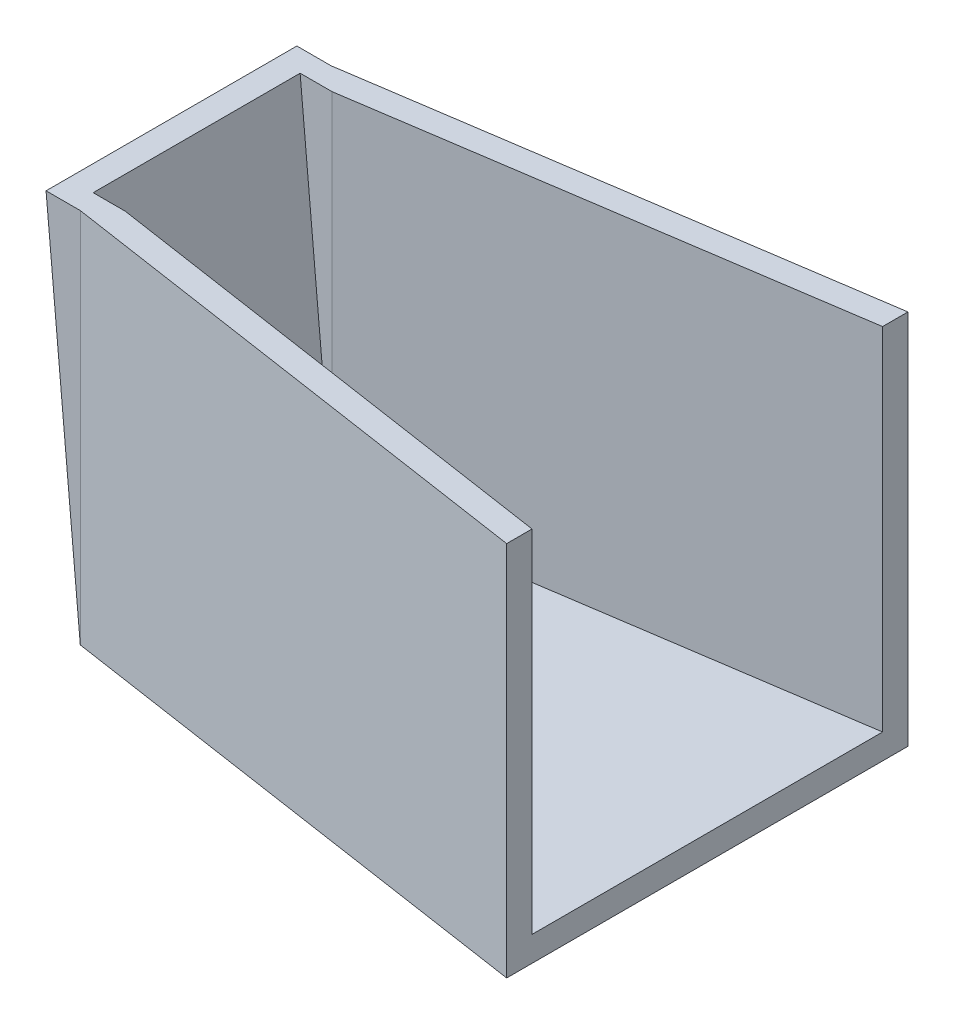
ISO-10303-21;
HEADER;
FILE_DESCRIPTION(('STEP AP214'),'2;1');
FILE_NAME('part.step','',(''),(''),'','','');
FILE_SCHEMA(('AUTOMOTIVE_DESIGN { 1 0 10303 214 1 1 1 1 }'));
ENDSEC;
DATA;
#1=APPLICATION_CONTEXT('core data for automotive mechanical design processes');
#2=APPLICATION_PROTOCOL_DEFINITION('international standard','automotive_design',2000,#1);
#3=PRODUCT_CONTEXT('',#1,'mechanical');
#4=PRODUCT('Part','Part','',(#3));
#5=PRODUCT_RELATED_PRODUCT_CATEGORY('part','',(#4));
#6=PRODUCT_DEFINITION_FORMATION('','',#4);
#7=PRODUCT_DEFINITION_CONTEXT('part definition',#1,'design');
#8=PRODUCT_DEFINITION('design','',#6,#7);
#9=PRODUCT_DEFINITION_SHAPE('','',#8);
#10=(LENGTH_UNIT() NAMED_UNIT(*) SI_UNIT(.MILLI.,.METRE.));
#11=(NAMED_UNIT(*) PLANE_ANGLE_UNIT() SI_UNIT($,.RADIAN.));
#12=(NAMED_UNIT(*) SI_UNIT($,.STERADIAN.) SOLID_ANGLE_UNIT());
#13=UNCERTAINTY_MEASURE_WITH_UNIT(LENGTH_MEASURE(1.E-05),#10,'distance_accuracy_value','');
#14=(GEOMETRIC_REPRESENTATION_CONTEXT(3) GLOBAL_UNCERTAINTY_ASSIGNED_CONTEXT((#13)) GLOBAL_UNIT_ASSIGNED_CONTEXT((#10,
#11,#12)) REPRESENTATION_CONTEXT('',''));
#15=CARTESIAN_POINT('',(0.,0.,0.));
#16=DIRECTION('',(0.,0.,1.));
#17=DIRECTION('',(1.,0.,0.));
#18=AXIS2_PLACEMENT_3D('',#15,#16,#17);
#19=CARTESIAN_POINT('',(0.,0.,15.));
#20=DIRECTION('',(0.,0.,1.));
#21=DIRECTION('',(1.,0.,0.));
#22=AXIS2_PLACEMENT_3D('',#19,#20,#21);
#23=PLANE('',#22);
#24=DIRECTION('',(-0.0906325801977735,0.995884398615971,0.));
#25=VECTOR('',#24,1.);
#26=CARTESIAN_POINT('',(-59.5071441244016,-5.4155743575164,15.));
#27=LINE('',#26,#25);
#28=CARTESIAN_POINT('',(-60.,0.,15.));
#29=VERTEX_POINT('',#28);
#30=CARTESIAN_POINT('',(-64.095320816922,45.,15.));
#31=VERTEX_POINT('',#30);
#32=EDGE_CURVE('E124',#29,#31,#27,.T.);
#33=ORIENTED_EDGE('',*,*,#32,.F.);
#34=DIRECTION('',(0.,-1.,0.));
#35=VECTOR('',#34,1.);
#36=CARTESIAN_POINT('',(-60.,3.,15.));
#37=LINE('',#36,#35);
#38=CARTESIAN_POINT('',(-60.,45.,15.));
#39=VERTEX_POINT('',#38);
#40=EDGE_CURVE('E49',#39,#29,#37,.T.);
#41=ORIENTED_EDGE('',*,*,#40,.F.);
#42=DIRECTION('',(1.,0.,0.));
#43=VECTOR('',#42,1.);
#44=CARTESIAN_POINT('',(0.,45.,15.));
#45=LINE('',#44,#43);
#46=EDGE_CURVE('E138',#31,#39,#45,.T.);
#47=ORIENTED_EDGE('',*,*,#46,.F.);
#48=EDGE_LOOP('',(#33,#41,#47));
#49=FACE_BOUND('',#48,.T.);
#50=ADVANCED_FACE('F41',(#49),#23,.T.);
#51=CARTESIAN_POINT('',(0.,0.,-15.));
#52=DIRECTION('',(0.,0.,1.));
#53=DIRECTION('',(1.,0.,0.));
#54=AXIS2_PLACEMENT_3D('',#51,#52,#53);
#55=PLANE('',#54);
#56=DIRECTION('',(-0.0906325801977735,0.995884398615971,0.));
#57=VECTOR('',#56,1.);
#58=CARTESIAN_POINT('',(-59.5071441244016,-5.4155743575164,-15.));
#59=LINE('',#58,#57);
#60=CARTESIAN_POINT('',(-60.,0.,-15.));
#61=VERTEX_POINT('',#60);
#62=CARTESIAN_POINT('',(-64.095320816922,45.,-15.));
#63=VERTEX_POINT('',#62);
#64=EDGE_CURVE('E126',#61,#63,#59,.T.);
#65=ORIENTED_EDGE('',*,*,#64,.T.);
#66=DIRECTION('',(1.,0.,0.));
#67=VECTOR('',#66,1.);
#68=CARTESIAN_POINT('',(0.,45.,-15.));
#69=LINE('',#68,#67);
#70=CARTESIAN_POINT('',(-60.,45.,-15.));
#71=VERTEX_POINT('',#70);
#72=EDGE_CURVE('E180',#63,#71,#69,.T.);
#73=ORIENTED_EDGE('',*,*,#72,.T.);
#74=DIRECTION('',(0.,-1.,0.));
#75=VECTOR('',#74,1.);
#76=CARTESIAN_POINT('',(-60.,3.,-15.));
#77=LINE('',#76,#75);
#78=EDGE_CURVE('E11',#71,#61,#77,.T.);
#79=ORIENTED_EDGE('',*,*,#78,.T.);
#80=EDGE_LOOP('',(#65,#73,#79));
#81=FACE_BOUND('',#80,.T.);
#82=ADVANCED_FACE('F242',(#81),#55,.F.);
#83=CARTESIAN_POINT('',(0.,0.,0.));
#84=DIRECTION('',(0.,1.,0.));
#85=DIRECTION('',(0.,0.,1.));
#86=AXIS2_PLACEMENT_3D('',#83,#84,#85);
#87=PLANE('',#86);
#88=DIRECTION('',(0.988936352868298,0.,0.148340452930245));
#89=VECTOR('',#88,1.);
#90=CARTESIAN_POINT('',(-3.52078239608802,0.,23.4718826405868));
#91=LINE('',#90,#89);
#92=CARTESIAN_POINT('',(0.,0.,24.));
#93=VERTEX_POINT('',#92);
#94=EDGE_CURVE('E130',#29,#93,#91,.T.);
#95=ORIENTED_EDGE('',*,*,#94,.F.);
#96=DIRECTION('',(0.,0.,-1.));
#97=VECTOR('',#96,1.);
#98=CARTESIAN_POINT('',(-60.,0.,0.));
#99=LINE('',#98,#97);
#100=EDGE_CURVE('E120',#29,#61,#99,.T.);
#101=ORIENTED_EDGE('',*,*,#100,.T.);
#102=DIRECTION('',(0.988936352868298,0.,-0.148340452930245));
#103=VECTOR('',#102,1.);
#104=CARTESIAN_POINT('',(-3.52078239608802,0.,-23.4718826405868));
#105=LINE('',#104,#103);
#106=CARTESIAN_POINT('',(0.,0.,-24.));
#107=VERTEX_POINT('',#106);
#108=EDGE_CURVE('E131',#61,#107,#105,.T.);
#109=ORIENTED_EDGE('',*,*,#108,.T.);
#110=DIRECTION('',(0.,0.,-1.));
#111=VECTOR('',#110,1.);
#112=CARTESIAN_POINT('',(0.,0.,0.));
#113=LINE('',#112,#111);
#114=EDGE_CURVE('E149',#93,#107,#113,.T.);
#115=ORIENTED_EDGE('',*,*,#114,.F.);
#116=EDGE_LOOP('',(#95,#101,#109,#115));
#117=FACE_BOUND('',#116,.T.);
#118=ADVANCED_FACE('F148',(#117),#87,.F.);
#119=CARTESIAN_POINT('',(-59.5071441244016,-5.4155743575164,15.));
#120=DIRECTION('',(-0.995884398615971,-0.0906325801977735,0.));
#121=DIRECTION('',(0.0906325801977735,-0.995884398615971,0.));
#122=AXIS2_PLACEMENT_3D('',#119,#120,#121);
#123=PLANE('',#122);
#124=ORIENTED_EDGE('',*,*,#100,.F.);
#125=ORIENTED_EDGE('',*,*,#32,.T.);
#126=DIRECTION('',(0.,0.,-1.));
#127=VECTOR('',#126,1.);
#128=CARTESIAN_POINT('',(-64.095320816922,45.,15.));
#129=LINE('',#128,#127);
#130=EDGE_CURVE('E186',#31,#63,#129,.T.);
#131=ORIENTED_EDGE('',*,*,#130,.T.);
#132=ORIENTED_EDGE('',*,*,#64,.F.);
#133=EDGE_LOOP('',(#124,#125,#131,#132));
#134=FACE_BOUND('',#133,.T.);
#135=ADVANCED_FACE('F122',(#134),#123,.T.);
#136=CARTESIAN_POINT('',(-56.5194909285537,-5.14367661692308,15.));
#137=DIRECTION('',(0.995884398615971,0.0906325801977735,0.));
#138=DIRECTION('',(-0.0906325801977735,0.995884398615971,0.));
#139=AXIS2_PLACEMENT_3D('',#136,#137,#138);
#140=PLANE('',#139);
#141=DIRECTION('',(0.,0.,-1.));
#142=VECTOR('',#141,1.);
#143=CARTESIAN_POINT('',(-57.2606235591219,3.,0.));
#144=LINE('',#143,#142);
#145=CARTESIAN_POINT('',(-57.2606235591219,3.,12.3773442037082));
#146=VERTEX_POINT('',#145);
#147=CARTESIAN_POINT('',(-57.2606235591219,3.00000000000002,-12.3773442037082));
#148=VERTEX_POINT('',#147);
#149=EDGE_CURVE('E188',#146,#148,#144,.T.);
#150=ORIENTED_EDGE('',*,*,#149,.T.);
#151=DIRECTION('',(-0.0906325801977735,0.995884398615971,0.));
#152=VECTOR('',#151,1.);
#153=CARTESIAN_POINT('',(-56.5194909285537,-5.14367661692308,-12.3773442037082));
#154=LINE('',#153,#152);
#155=CARTESIAN_POINT('',(-61.082922988249,45.,-12.3773442037082));
#156=VERTEX_POINT('',#155);
#157=EDGE_CURVE('E174',#148,#156,#154,.T.);
#158=ORIENTED_EDGE('',*,*,#157,.T.);
#159=DIRECTION('',(0.,0.,-1.));
#160=VECTOR('',#159,1.);
#161=CARTESIAN_POINT('',(-61.082922988249,45.,15.));
#162=LINE('',#161,#160);
#163=CARTESIAN_POINT('',(-61.082922988249,45.,12.3773442037082));
#164=VERTEX_POINT('',#163);
#165=EDGE_CURVE('E139',#164,#156,#162,.T.);
#166=ORIENTED_EDGE('',*,*,#165,.F.);
#167=DIRECTION('',(0.0906325801977735,-0.995884398615971,0.));
#168=VECTOR('',#167,1.);
#169=CARTESIAN_POINT('',(-56.5194909285537,-5.14367661692308,12.3773442037082));
#170=LINE('',#169,#168);
#171=EDGE_CURVE('E219',#164,#146,#170,.T.);
#172=ORIENTED_EDGE('',*,*,#171,.T.);
#173=EDGE_LOOP('',(#150,#158,#166,#172));
#174=FACE_BOUND('',#173,.T.);
#175=ADVANCED_FACE('F217',(#174),#140,.T.);
#176=CARTESIAN_POINT('',(-3.52078239608802,3.,-23.4718826405868));
#177=DIRECTION('',(-0.148340452930245,0.,-0.988936352868298));
#178=DIRECTION('',(-0.988936352868298,0.,0.148340452930245));
#179=AXIS2_PLACEMENT_3D('',#176,#177,#178);
#180=PLANE('',#179);
#181=ORIENTED_EDGE('',*,*,#108,.F.);
#182=ORIENTED_EDGE('',*,*,#78,.F.);
#183=DIRECTION('',(-0.988936352868298,0.,0.148340452930245));
#184=VECTOR('',#183,1.);
#185=CARTESIAN_POINT('',(-3.52078239608802,45.,-23.4718826405868));
#186=LINE('',#185,#184);
#187=CARTESIAN_POINT('',(0.,45.,-24.));
#188=VERTEX_POINT('',#187);
#189=EDGE_CURVE('E193',#188,#71,#186,.T.);
#190=ORIENTED_EDGE('',*,*,#189,.F.);
#191=DIRECTION('',(0.,-1.,0.));
#192=VECTOR('',#191,1.);
#193=CARTESIAN_POINT('',(0.,3.,-24.));
#194=LINE('',#193,#192);
#195=EDGE_CURVE('E64',#188,#107,#194,.T.);
#196=ORIENTED_EDGE('',*,*,#195,.T.);
#197=EDGE_LOOP('',(#181,#182,#190,#196));
#198=FACE_BOUND('',#197,.T.);
#199=ADVANCED_FACE('F43',(#198),#180,.T.);
#200=CARTESIAN_POINT('',(-3.52078239608802,3.,23.4718826405868));
#201=DIRECTION('',(0.148340452930245,0.,-0.988936352868298));
#202=DIRECTION('',(-0.988936352868298,0.,-0.148340452930245));
#203=AXIS2_PLACEMENT_3D('',#200,#201,#202);
#204=PLANE('',#203);
#205=ORIENTED_EDGE('',*,*,#94,.T.);
#206=DIRECTION('',(0.,-1.,0.));
#207=VECTOR('',#206,1.);
#208=CARTESIAN_POINT('',(0.,3.,24.));
#209=LINE('',#208,#207);
#210=CARTESIAN_POINT('',(0.,45.,24.));
#211=VERTEX_POINT('',#210);
#212=EDGE_CURVE('E146',#211,#93,#209,.T.);
#213=ORIENTED_EDGE('',*,*,#212,.F.);
#214=DIRECTION('',(0.988936352868298,0.,0.148340452930245));
#215=VECTOR('',#214,1.);
#216=CARTESIAN_POINT('',(-3.52078239608802,45.,23.4718826405868));
#217=LINE('',#216,#215);
#218=EDGE_CURVE('E145',#39,#211,#217,.T.);
#219=ORIENTED_EDGE('',*,*,#218,.F.);
#220=ORIENTED_EDGE('',*,*,#40,.T.);
#221=EDGE_LOOP('',(#205,#213,#219,#220));
#222=FACE_BOUND('',#221,.T.);
#223=ADVANCED_FACE('F142',(#222),#204,.F.);
#224=CARTESIAN_POINT('',(0.,3.,0.));
#225=DIRECTION('',(-1.,0.,0.));
#226=DIRECTION('',(0.,0.,1.));
#227=AXIS2_PLACEMENT_3D('',#224,#225,#226);
#228=PLANE('',#227);
#229=ORIENTED_EDGE('',*,*,#114,.T.);
#230=ORIENTED_EDGE('',*,*,#195,.F.);
#231=DIRECTION('',(0.,0.,-1.));
#232=VECTOR('',#231,1.);
#233=CARTESIAN_POINT('',(0.,45.,0.));
#234=LINE('',#233,#232);
#235=CARTESIAN_POINT('',(0.,45.,-20.9664377375765));
#236=VERTEX_POINT('',#235);
#237=EDGE_CURVE('E199',#236,#188,#234,.T.);
#238=ORIENTED_EDGE('',*,*,#237,.F.);
#239=DIRECTION('',(0.,-1.,0.));
#240=VECTOR('',#239,1.);
#241=CARTESIAN_POINT('',(0.,45.,-20.9664377375765));
#242=LINE('',#241,#240);
#243=CARTESIAN_POINT('',(0.,3.,-20.9664377375765));
#244=VERTEX_POINT('',#243);
#245=EDGE_CURVE('E182',#236,#244,#242,.T.);
#246=ORIENTED_EDGE('',*,*,#245,.T.);
#247=DIRECTION('',(0.,0.,-1.));
#248=VECTOR('',#247,1.);
#249=CARTESIAN_POINT('',(0.,3.,0.));
#250=LINE('',#249,#248);
#251=CARTESIAN_POINT('',(0.,3.,20.9664377375765));
#252=VERTEX_POINT('',#251);
#253=EDGE_CURVE('E56',#252,#244,#250,.T.);
#254=ORIENTED_EDGE('',*,*,#253,.F.);
#255=DIRECTION('',(0.,-1.,0.));
#256=VECTOR('',#255,1.);
#257=CARTESIAN_POINT('',(0.,45.,20.9664377375765));
#258=LINE('',#257,#256);
#259=CARTESIAN_POINT('',(0.,45.,20.9664377375765));
#260=VERTEX_POINT('',#259);
#261=EDGE_CURVE('E166',#260,#252,#258,.T.);
#262=ORIENTED_EDGE('',*,*,#261,.F.);
#263=DIRECTION('',(0.,0.,-1.));
#264=VECTOR('',#263,1.);
#265=CARTESIAN_POINT('',(0.,45.,0.));
#266=LINE('',#265,#264);
#267=EDGE_CURVE('E159',#211,#260,#266,.T.);
#268=ORIENTED_EDGE('',*,*,#267,.F.);
#269=ORIENTED_EDGE('',*,*,#212,.T.);
#270=EDGE_LOOP('',(#229,#230,#238,#246,#254,#262,#268,#269));
#271=FACE_BOUND('',#270,.T.);
#272=ADVANCED_FACE('F157',(#271),#228,.F.);
#273=CARTESIAN_POINT('',(0.,3.,0.));
#274=DIRECTION('',(0.,1.,0.));
#275=DIRECTION('',(0.,0.,1.));
#276=AXIS2_PLACEMENT_3D('',#273,#274,#275);
#277=PLANE('',#276);
#278=DIRECTION('',(-0.988936352868298,0.,0.148340452930245));
#279=VECTOR('',#278,1.);
#280=CARTESIAN_POINT('',(-3.07576103729729,3.,-20.5050735819819));
#281=LINE('',#280,#279);
#282=EDGE_CURVE('E178',#244,#148,#281,.T.);
#283=ORIENTED_EDGE('',*,*,#282,.T.);
#284=ORIENTED_EDGE('',*,*,#149,.F.);
#285=DIRECTION('',(0.988936352868298,0.,0.148340452930245));
#286=VECTOR('',#285,1.);
#287=CARTESIAN_POINT('',(-3.07576103729729,3.,20.5050735819819));
#288=LINE('',#287,#286);
#289=EDGE_CURVE('E169',#146,#252,#288,.T.);
#290=ORIENTED_EDGE('',*,*,#289,.T.);
#291=ORIENTED_EDGE('',*,*,#253,.T.);
#292=EDGE_LOOP('',(#283,#284,#290,#291));
#293=FACE_BOUND('',#292,.T.);
#294=ADVANCED_FACE('F213',(#293),#277,.T.);
#295=CARTESIAN_POINT('',(0.,45.,15.));
#296=DIRECTION('',(0.,1.,0.));
#297=DIRECTION('',(0.,0.,1.));
#298=AXIS2_PLACEMENT_3D('',#295,#296,#297);
#299=PLANE('',#298);
#300=DIRECTION('',(1.,0.,0.));
#301=VECTOR('',#300,1.);
#302=CARTESIAN_POINT('',(-61.2606235591219,45.,12.3773442037082));
#303=LINE('',#302,#301);
#304=CARTESIAN_POINT('',(-57.2606235591219,45.,12.3773442037082));
#305=VERTEX_POINT('',#304);
#306=EDGE_CURVE('E227',#164,#305,#303,.T.);
#307=ORIENTED_EDGE('',*,*,#306,.F.);
#308=ORIENTED_EDGE('',*,*,#165,.T.);
#309=DIRECTION('',(1.,0.,0.));
#310=VECTOR('',#309,1.);
#311=CARTESIAN_POINT('',(-61.2606235591219,45.,-12.3773442037082));
#312=LINE('',#311,#310);
#313=CARTESIAN_POINT('',(-57.2606235591219,45.,-12.3773442037082));
#314=VERTEX_POINT('',#313);
#315=EDGE_CURVE('E222',#156,#314,#312,.T.);
#316=ORIENTED_EDGE('',*,*,#315,.T.);
#317=DIRECTION('',(-0.988936352868298,0.,0.148340452930245));
#318=VECTOR('',#317,1.);
#319=CARTESIAN_POINT('',(-3.07576103729729,45.,-20.5050735819819));
#320=LINE('',#319,#318);
#321=EDGE_CURVE('E204',#236,#314,#320,.T.);
#322=ORIENTED_EDGE('',*,*,#321,.F.);
#323=ORIENTED_EDGE('',*,*,#237,.T.);
#324=ORIENTED_EDGE('',*,*,#189,.T.);
#325=ORIENTED_EDGE('',*,*,#72,.F.);
#326=ORIENTED_EDGE('',*,*,#130,.F.);
#327=ORIENTED_EDGE('',*,*,#46,.T.);
#328=ORIENTED_EDGE('',*,*,#218,.T.);
#329=ORIENTED_EDGE('',*,*,#267,.T.);
#330=DIRECTION('',(0.988936352868298,0.,0.148340452930245));
#331=VECTOR('',#330,1.);
#332=CARTESIAN_POINT('',(-3.07576103729729,45.,20.5050735819819));
#333=LINE('',#332,#331);
#334=EDGE_CURVE('E164',#305,#260,#333,.T.);
#335=ORIENTED_EDGE('',*,*,#334,.F.);
#336=EDGE_LOOP('',(#307,#308,#316,#322,#323,#324,#325,#326,#327,#328,#329,#335));
#337=FACE_BOUND('',#336,.T.);
#338=ADVANCED_FACE('F162',(#337),#299,.T.);
#339=CARTESIAN_POINT('',(-3.07576103729729,45.,-20.5050735819819));
#340=DIRECTION('',(0.148340452930245,0.,0.988936352868297));
#341=DIRECTION('',(0.988936352868298,0.,-0.148340452930245));
#342=AXIS2_PLACEMENT_3D('',#339,#340,#341);
#343=PLANE('',#342);
#344=ORIENTED_EDGE('',*,*,#282,.F.);
#345=ORIENTED_EDGE('',*,*,#245,.F.);
#346=ORIENTED_EDGE('',*,*,#321,.T.);
#347=DIRECTION('',(0.,-1.,0.));
#348=VECTOR('',#347,1.);
#349=CARTESIAN_POINT('',(-57.2606235591219,45.,-12.3773442037082));
#350=LINE('',#349,#348);
#351=EDGE_CURVE('E200',#314,#148,#350,.T.);
#352=ORIENTED_EDGE('',*,*,#351,.T.);
#353=EDGE_LOOP('',(#344,#345,#346,#352));
#354=FACE_BOUND('',#353,.T.);
#355=ADVANCED_FACE('F211',(#354),#343,.T.);
#356=CARTESIAN_POINT('',(-3.07576103729729,45.,20.5050735819819));
#357=DIRECTION('',(0.148340452930245,0.,-0.988936352868297));
#358=DIRECTION('',(-0.988936352868298,0.,-0.148340452930245));
#359=AXIS2_PLACEMENT_3D('',#356,#357,#358);
#360=PLANE('',#359);
#361=ORIENTED_EDGE('',*,*,#289,.F.);
#362=DIRECTION('',(0.,-1.,0.));
#363=VECTOR('',#362,1.);
#364=CARTESIAN_POINT('',(-57.2606235591219,45.,12.3773442037082));
#365=LINE('',#364,#363);
#366=EDGE_CURVE('E176',#305,#146,#365,.T.);
#367=ORIENTED_EDGE('',*,*,#366,.F.);
#368=ORIENTED_EDGE('',*,*,#334,.T.);
#369=ORIENTED_EDGE('',*,*,#261,.T.);
#370=EDGE_LOOP('',(#361,#367,#368,#369));
#371=FACE_BOUND('',#370,.T.);
#372=ADVANCED_FACE('F226',(#371),#360,.T.);
#373=CARTESIAN_POINT('',(-61.2606235591219,0.,12.3773442037082));
#374=DIRECTION('',(0.,0.,1.));
#375=DIRECTION('',(1.,0.,0.));
#376=AXIS2_PLACEMENT_3D('',#373,#374,#375);
#377=PLANE('',#376);
#378=ORIENTED_EDGE('',*,*,#171,.F.);
#379=ORIENTED_EDGE('',*,*,#306,.T.);
#380=ORIENTED_EDGE('',*,*,#366,.T.);
#381=EDGE_LOOP('',(#378,#379,#380));
#382=FACE_BOUND('',#381,.T.);
#383=ADVANCED_FACE('F235',(#382),#377,.F.);
#384=CARTESIAN_POINT('',(-61.2606235591219,0.,-12.3773442037082));
#385=DIRECTION('',(0.,0.,-1.));
#386=DIRECTION('',(-1.,0.,0.));
#387=AXIS2_PLACEMENT_3D('',#384,#385,#386);
#388=PLANE('',#387);
#389=ORIENTED_EDGE('',*,*,#157,.F.);
#390=ORIENTED_EDGE('',*,*,#351,.F.);
#391=ORIENTED_EDGE('',*,*,#315,.F.);
#392=EDGE_LOOP('',(#389,#390,#391));
#393=FACE_BOUND('',#392,.T.);
#394=ADVANCED_FACE('F233',(#393),#388,.F.);
#395=CLOSED_SHELL('',(#50,#82,#118,#135,#175,#199,#223,#272,#294,#338,#355,#372,#383,#394));
#396=MANIFOLD_SOLID_BREP('B2',#395);
#397=ADVANCED_BREP_SHAPE_REPRESENTATION('',(#18,#396),#14);
#398=SHAPE_DEFINITION_REPRESENTATION(#9,#397);
ENDSEC;
END-ISO-10303-21;
